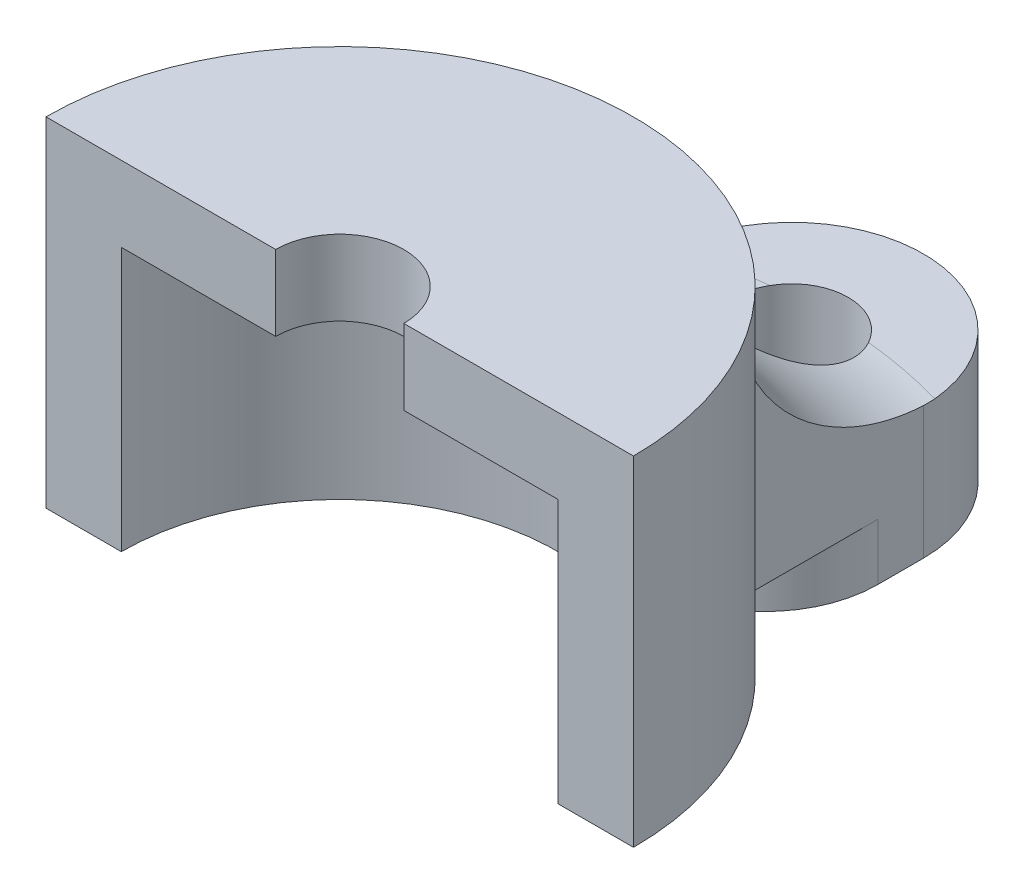
ISO-10303-21;
HEADER;
FILE_DESCRIPTION(('STEP AP214'),'2;1');
FILE_NAME('part.step','',(''),(''),'','','');
FILE_SCHEMA(('AUTOMOTIVE_DESIGN { 1 0 10303 214 1 1 1 1 }'));
ENDSEC;
DATA;
#1=APPLICATION_CONTEXT('core data for automotive mechanical design processes');
#2=APPLICATION_PROTOCOL_DEFINITION('international standard','automotive_design',2000,#1);
#3=PRODUCT_CONTEXT('',#1,'mechanical');
#4=PRODUCT('Part','Part','',(#3));
#5=PRODUCT_RELATED_PRODUCT_CATEGORY('part','',(#4));
#6=PRODUCT_DEFINITION_FORMATION('','',#4);
#7=PRODUCT_DEFINITION_CONTEXT('part definition',#1,'design');
#8=PRODUCT_DEFINITION('design','',#6,#7);
#9=PRODUCT_DEFINITION_SHAPE('','',#8);
#10=(LENGTH_UNIT() NAMED_UNIT(*) SI_UNIT(.MILLI.,.METRE.));
#11=(NAMED_UNIT(*) PLANE_ANGLE_UNIT() SI_UNIT($,.RADIAN.));
#12=(NAMED_UNIT(*) SI_UNIT($,.STERADIAN.) SOLID_ANGLE_UNIT());
#13=UNCERTAINTY_MEASURE_WITH_UNIT(LENGTH_MEASURE(1.E-05),#10,'distance_accuracy_value','');
#14=(GEOMETRIC_REPRESENTATION_CONTEXT(3) GLOBAL_UNCERTAINTY_ASSIGNED_CONTEXT((#13)) GLOBAL_UNIT_ASSIGNED_CONTEXT((#10,
#11,#12)) REPRESENTATION_CONTEXT('',''));
#15=CARTESIAN_POINT('',(0.,0.,0.));
#16=DIRECTION('',(0.,0.,1.));
#17=DIRECTION('',(1.,0.,0.));
#18=AXIS2_PLACEMENT_3D('',#15,#16,#17);
#19=CARTESIAN_POINT('',(0.,7.,0.));
#20=DIRECTION('',(0.,-1.,0.));
#21=DIRECTION('',(0.,0.,-1.));
#22=AXIS2_PLACEMENT_3D('',#19,#20,#21);
#23=CYLINDRICAL_SURFACE('',#22,7.8);
#24=DIRECTION('',(0.,-1.,0.));
#25=VECTOR('',#24,1.);
#26=CARTESIAN_POINT('',(3.5,2.,-6.97065276713738));
#27=LINE('',#26,#25);
#28=CARTESIAN_POINT('',(3.5,7.,-6.97065276713738));
#29=VERTEX_POINT('',#28);
#30=CARTESIAN_POINT('',(3.5,0.,-6.97065276713738));
#31=VERTEX_POINT('',#30);
#32=EDGE_CURVE('E207',#29,#31,#27,.T.);
#33=ORIENTED_EDGE('',*,*,#32,.F.);
#34=CARTESIAN_POINT('',(0.,7.,0.));
#35=DIRECTION('',(0.,-1.,0.));
#36=DIRECTION('',(0.,0.,-1.));
#37=AXIS2_PLACEMENT_3D('',#34,#35,#36);
#38=CIRCLE('',#37,7.8);
#39=CARTESIAN_POINT('',(-3.5,7.,-6.97065276713738));
#40=VERTEX_POINT('',#39);
#41=EDGE_CURVE('E285',#29,#40,#38,.F.);
#42=ORIENTED_EDGE('',*,*,#41,.T.);
#43=DIRECTION('',(0.,-1.,0.));
#44=VECTOR('',#43,1.);
#45=CARTESIAN_POINT('',(-3.5,2.,-6.97065276713738));
#46=LINE('',#45,#44);
#47=CARTESIAN_POINT('',(-3.5,0.,-6.97065276713738));
#48=VERTEX_POINT('',#47);
#49=EDGE_CURVE('E202',#40,#48,#46,.T.);
#50=ORIENTED_EDGE('',*,*,#49,.T.);
#51=CARTESIAN_POINT('',(0.,0.,0.));
#52=DIRECTION('',(0.,1.,0.));
#53=DIRECTION('',(0.,0.,1.));
#54=AXIS2_PLACEMENT_3D('',#51,#52,#53);
#55=CIRCLE('',#54,7.8);
#56=CARTESIAN_POINT('',(-7.8,0.,0.));
#57=VERTEX_POINT('',#56);
#58=EDGE_CURVE('E243',#48,#57,#55,.T.);
#59=ORIENTED_EDGE('',*,*,#58,.T.);
#60=DIRECTION('',(0.,-1.,0.));
#61=VECTOR('',#60,1.);
#62=CARTESIAN_POINT('',(-7.8,7.,0.));
#63=LINE('',#62,#61);
#64=CARTESIAN_POINT('',(-7.8,9.,0.));
#65=VERTEX_POINT('',#64);
#66=EDGE_CURVE('E274',#65,#57,#63,.T.);
#67=ORIENTED_EDGE('',*,*,#66,.F.);
#68=CARTESIAN_POINT('',(0.,9.,0.));
#69=DIRECTION('',(0.,1.,0.));
#70=DIRECTION('',(0.,0.,1.));
#71=AXIS2_PLACEMENT_3D('',#68,#69,#70);
#72=CIRCLE('',#71,7.8);
#73=CARTESIAN_POINT('',(7.8,9.,0.));
#74=VERTEX_POINT('',#73);
#75=EDGE_CURVE('E212',#74,#65,#72,.T.);
#76=ORIENTED_EDGE('',*,*,#75,.F.);
#77=DIRECTION('',(0.,-1.,0.));
#78=VECTOR('',#77,1.);
#79=CARTESIAN_POINT('',(7.8,7.,0.));
#80=LINE('',#79,#78);
#81=CARTESIAN_POINT('',(7.8,0.,0.));
#82=VERTEX_POINT('',#81);
#83=EDGE_CURVE('E248',#74,#82,#80,.T.);
#84=ORIENTED_EDGE('',*,*,#83,.T.);
#85=EDGE_CURVE('E250',#82,#31,#55,.T.);
#86=ORIENTED_EDGE('',*,*,#85,.T.);
#87=EDGE_LOOP('',(#33,#42,#50,#59,#67,#76,#84,#86));
#88=FACE_BOUND('',#87,.T.);
#89=ADVANCED_FACE('F42',(#88),#23,.T.);
#90=CARTESIAN_POINT('',(-7.8,7.,0.));
#91=DIRECTION('',(0.,0.,-1.));
#92=DIRECTION('',(-1.,0.,0.));
#93=AXIS2_PLACEMENT_3D('',#90,#91,#92);
#94=PLANE('',#93);
#95=DIRECTION('',(1.,0.,0.));
#96=VECTOR('',#95,1.);
#97=CARTESIAN_POINT('',(-7.8,0.,0.));
#98=LINE('',#97,#96);
#99=CARTESIAN_POINT('',(-5.8,0.,0.));
#100=VERTEX_POINT('',#99);
#101=EDGE_CURVE('E254',#57,#100,#98,.T.);
#102=ORIENTED_EDGE('',*,*,#101,.T.);
#103=DIRECTION('',(0.,-1.,0.));
#104=VECTOR('',#103,1.);
#105=CARTESIAN_POINT('',(-5.8,7.,0.));
#106=LINE('',#105,#104);
#107=CARTESIAN_POINT('',(-5.8,7.,0.));
#108=VERTEX_POINT('',#107);
#109=EDGE_CURVE('E270',#108,#100,#106,.T.);
#110=ORIENTED_EDGE('',*,*,#109,.F.);
#111=DIRECTION('',(1.,0.,0.));
#112=VECTOR('',#111,1.);
#113=CARTESIAN_POINT('',(-7.8,7.,0.));
#114=LINE('',#113,#112);
#115=CARTESIAN_POINT('',(-1.7,7.,0.));
#116=VERTEX_POINT('',#115);
#117=EDGE_CURVE('E206',#108,#116,#114,.T.);
#118=ORIENTED_EDGE('',*,*,#117,.T.);
#119=DIRECTION('',(0.,-1.,0.));
#120=VECTOR('',#119,1.);
#121=CARTESIAN_POINT('',(-1.7,9.,0.));
#122=LINE('',#121,#120);
#123=CARTESIAN_POINT('',(-1.7,9.,0.));
#124=VERTEX_POINT('',#123);
#125=EDGE_CURVE('E239',#124,#116,#122,.T.);
#126=ORIENTED_EDGE('',*,*,#125,.F.);
#127=DIRECTION('',(1.,0.,0.));
#128=VECTOR('',#127,1.);
#129=CARTESIAN_POINT('',(-7.8,9.,0.));
#130=LINE('',#129,#128);
#131=EDGE_CURVE('E216',#65,#124,#130,.T.);
#132=ORIENTED_EDGE('',*,*,#131,.F.);
#133=ORIENTED_EDGE('',*,*,#66,.T.);
#134=EDGE_LOOP('',(#102,#110,#118,#126,#132,#133));
#135=FACE_BOUND('',#134,.T.);
#136=ADVANCED_FACE('F364',(#135),#94,.F.);
#137=CARTESIAN_POINT('',(0.,7.,0.));
#138=DIRECTION('',(0.,-1.,0.));
#139=DIRECTION('',(0.,0.,-1.));
#140=AXIS2_PLACEMENT_3D('',#137,#138,#139);
#141=CYLINDRICAL_SURFACE('',#140,5.8);
#142=CARTESIAN_POINT('',(0.,0.,0.));
#143=DIRECTION('',(0.,-1.,0.));
#144=DIRECTION('',(0.,0.,1.));
#145=AXIS2_PLACEMENT_3D('',#142,#143,#144);
#146=CIRCLE('',#145,5.8);
#147=CARTESIAN_POINT('',(5.8,0.,0.));
#148=VERTEX_POINT('',#147);
#149=EDGE_CURVE('E258',#100,#148,#146,.T.);
#150=ORIENTED_EDGE('',*,*,#149,.T.);
#151=DIRECTION('',(0.,-1.,0.));
#152=VECTOR('',#151,1.);
#153=CARTESIAN_POINT('',(5.8,7.,0.));
#154=LINE('',#153,#152);
#155=CARTESIAN_POINT('',(5.8,7.,0.));
#156=VERTEX_POINT('',#155);
#157=EDGE_CURVE('E266',#156,#148,#154,.T.);
#158=ORIENTED_EDGE('',*,*,#157,.F.);
#159=CARTESIAN_POINT('',(0.,7.,0.));
#160=DIRECTION('',(0.,-1.,0.));
#161=DIRECTION('',(0.,0.,1.));
#162=AXIS2_PLACEMENT_3D('',#159,#160,#161);
#163=CIRCLE('',#162,5.8);
#164=EDGE_CURVE('E244',#108,#156,#163,.T.);
#165=ORIENTED_EDGE('',*,*,#164,.F.);
#166=ORIENTED_EDGE('',*,*,#109,.T.);
#167=EDGE_LOOP('',(#150,#158,#165,#166));
#168=FACE_BOUND('',#167,.T.);
#169=ADVANCED_FACE('F369',(#168),#141,.F.);
#170=CARTESIAN_POINT('',(5.8,7.,0.));
#171=DIRECTION('',(0.,0.,-1.));
#172=DIRECTION('',(-1.,0.,0.));
#173=AXIS2_PLACEMENT_3D('',#170,#171,#172);
#174=PLANE('',#173);
#175=DIRECTION('',(1.,0.,0.));
#176=VECTOR('',#175,1.);
#177=CARTESIAN_POINT('',(5.8,0.,0.));
#178=LINE('',#177,#176);
#179=EDGE_CURVE('E249',#148,#82,#178,.T.);
#180=ORIENTED_EDGE('',*,*,#179,.T.);
#181=ORIENTED_EDGE('',*,*,#83,.F.);
#182=DIRECTION('',(1.,0.,0.));
#183=VECTOR('',#182,1.);
#184=CARTESIAN_POINT('',(7.8,9.,0.));
#185=LINE('',#184,#183);
#186=CARTESIAN_POINT('',(1.7,9.,0.));
#187=VERTEX_POINT('',#186);
#188=EDGE_CURVE('E223',#187,#74,#185,.T.);
#189=ORIENTED_EDGE('',*,*,#188,.F.);
#190=DIRECTION('',(0.,-1.,0.));
#191=VECTOR('',#190,1.);
#192=CARTESIAN_POINT('',(1.7,9.,0.));
#193=LINE('',#192,#191);
#194=CARTESIAN_POINT('',(1.7,7.,0.));
#195=VERTEX_POINT('',#194);
#196=EDGE_CURVE('E227',#187,#195,#193,.T.);
#197=ORIENTED_EDGE('',*,*,#196,.T.);
#198=DIRECTION('',(1.,0.,0.));
#199=VECTOR('',#198,1.);
#200=CARTESIAN_POINT('',(7.8,7.,0.));
#201=LINE('',#200,#199);
#202=EDGE_CURVE('E217',#195,#156,#201,.T.);
#203=ORIENTED_EDGE('',*,*,#202,.T.);
#204=ORIENTED_EDGE('',*,*,#157,.T.);
#205=EDGE_LOOP('',(#180,#181,#189,#197,#203,#204));
#206=FACE_BOUND('',#205,.T.);
#207=ADVANCED_FACE('F455',(#206),#174,.F.);
#208=CARTESIAN_POINT('',(0.,0.,0.));
#209=DIRECTION('',(0.,1.,0.));
#210=DIRECTION('',(0.,0.,1.));
#211=AXIS2_PLACEMENT_3D('',#208,#209,#210);
#212=PLANE('',#211);
#213=ORIENTED_EDGE('',*,*,#85,.F.);
#214=ORIENTED_EDGE('',*,*,#179,.F.);
#215=ORIENTED_EDGE('',*,*,#149,.F.);
#216=ORIENTED_EDGE('',*,*,#101,.F.);
#217=ORIENTED_EDGE('',*,*,#58,.F.);
#218=DIRECTION('',(0.,0.,1.));
#219=VECTOR('',#218,1.);
#220=CARTESIAN_POINT('',(-3.5,0.,0.));
#221=LINE('',#220,#219);
#222=CARTESIAN_POINT('',(-3.5,0.,-10.7884197174563));
#223=VERTEX_POINT('',#222);
#224=EDGE_CURVE('E64',#223,#48,#221,.T.);
#225=ORIENTED_EDGE('',*,*,#224,.F.);
#226=CARTESIAN_POINT('',(-0.499999999999999,0.,-10.7884197174563));
#227=DIRECTION('',(0.,1.,0.));
#228=DIRECTION('',(0.,0.,1.));
#229=AXIS2_PLACEMENT_3D('',#226,#227,#228);
#230=CIRCLE('',#229,3.);
#231=CARTESIAN_POINT('',(-0.36111111111111,0.,-7.79163646260733));
#232=VERTEX_POINT('',#231);
#233=EDGE_CURVE('E11',#223,#232,#230,.T.);
#234=ORIENTED_EDGE('',*,*,#233,.T.);
#235=CARTESIAN_POINT('',(0.361111111111112,0.,-7.79163646260733));
#236=VERTEX_POINT('',#235);
#237=EDGE_CURVE('E255',#236,#232,#55,.T.);
#238=ORIENTED_EDGE('',*,*,#237,.F.);
#239=CARTESIAN_POINT('',(0.500000000000001,0.,-10.7884197174563));
#240=DIRECTION('',(0.,1.,0.));
#241=DIRECTION('',(0.,0.,1.));
#242=AXIS2_PLACEMENT_3D('',#239,#240,#241);
#243=CIRCLE('',#242,3.);
#244=CARTESIAN_POINT('',(3.5,0.,-10.7884197174563));
#245=VERTEX_POINT('',#244);
#246=EDGE_CURVE('E51',#236,#245,#243,.T.);
#247=ORIENTED_EDGE('',*,*,#246,.T.);
#248=DIRECTION('',(0.,0.,-1.));
#249=VECTOR('',#248,1.);
#250=CARTESIAN_POINT('',(3.5,0.,0.));
#251=LINE('',#250,#249);
#252=EDGE_CURVE('E58',#31,#245,#251,.T.);
#253=ORIENTED_EDGE('',*,*,#252,.F.);
#254=EDGE_LOOP('',(#213,#214,#215,#216,#217,#225,#234,#238,#247,#253));
#255=FACE_BOUND('',#254,.T.);
#256=ADVANCED_FACE('F405',(#255),#212,.F.);
#257=CARTESIAN_POINT('',(0.,7.,0.));
#258=DIRECTION('',(0.,1.,0.));
#259=DIRECTION('',(0.,0.,1.));
#260=AXIS2_PLACEMENT_3D('',#257,#258,#259);
#261=PLANE('',#260);
#262=ORIENTED_EDGE('',*,*,#117,.F.);
#263=ORIENTED_EDGE('',*,*,#164,.T.);
#264=ORIENTED_EDGE('',*,*,#202,.F.);
#265=CARTESIAN_POINT('',(0.,7.,0.));
#266=DIRECTION('',(0.,-1.,0.));
#267=DIRECTION('',(0.,0.,1.));
#268=AXIS2_PLACEMENT_3D('',#265,#266,#267);
#269=CIRCLE('',#268,1.7);
#270=EDGE_CURVE('E230',#116,#195,#269,.T.);
#271=ORIENTED_EDGE('',*,*,#270,.F.);
#272=EDGE_LOOP('',(#262,#263,#264,#271));
#273=FACE_BOUND('',#272,.T.);
#274=ADVANCED_FACE('F454',(#273),#261,.F.);
#275=CARTESIAN_POINT('',(0.,9.,0.));
#276=DIRECTION('',(0.,-1.,0.));
#277=DIRECTION('',(0.,0.,-1.));
#278=AXIS2_PLACEMENT_3D('',#275,#276,#277);
#279=CYLINDRICAL_SURFACE('',#278,1.7);
#280=ORIENTED_EDGE('',*,*,#270,.T.);
#281=ORIENTED_EDGE('',*,*,#196,.F.);
#282=CARTESIAN_POINT('',(0.,9.,0.));
#283=DIRECTION('',(0.,-1.,0.));
#284=DIRECTION('',(0.,0.,1.));
#285=AXIS2_PLACEMENT_3D('',#282,#283,#284);
#286=CIRCLE('',#285,1.7);
#287=EDGE_CURVE('E220',#124,#187,#286,.T.);
#288=ORIENTED_EDGE('',*,*,#287,.F.);
#289=ORIENTED_EDGE('',*,*,#125,.T.);
#290=EDGE_LOOP('',(#280,#281,#288,#289));
#291=FACE_BOUND('',#290,.T.);
#292=ADVANCED_FACE('F534',(#291),#279,.F.);
#293=CARTESIAN_POINT('',(0.,9.,0.));
#294=DIRECTION('',(0.,1.,0.));
#295=DIRECTION('',(0.,0.,1.));
#296=AXIS2_PLACEMENT_3D('',#293,#294,#295);
#297=PLANE('',#296);
#298=ORIENTED_EDGE('',*,*,#75,.T.);
#299=ORIENTED_EDGE('',*,*,#131,.T.);
#300=ORIENTED_EDGE('',*,*,#287,.T.);
#301=ORIENTED_EDGE('',*,*,#188,.T.);
#302=EDGE_LOOP('',(#298,#299,#300,#301));
#303=FACE_BOUND('',#302,.T.);
#304=ADVANCED_FACE('F353',(#303),#297,.T.);
#305=CARTESIAN_POINT('',(0.,2.,0.));
#306=DIRECTION('',(0.,-1.,0.));
#307=DIRECTION('',(0.,0.,-1.));
#308=AXIS2_PLACEMENT_3D('',#305,#306,#307);
#309=CYLINDRICAL_SURFACE('',#308,7.8);
#310=CARTESIAN_POINT('',(0.,-1.5,0.));
#311=DIRECTION('',(0.,-1.,0.));
#312=DIRECTION('',(0.,0.,-1.));
#313=AXIS2_PLACEMENT_3D('',#310,#311,#312);
#314=CIRCLE('',#313,7.8);
#315=CARTESIAN_POINT('',(-0.36111111111111,-1.5,-7.79163646260733));
#316=VERTEX_POINT('',#315);
#317=CARTESIAN_POINT('',(0.361111111111112,-1.5,-7.79163646260733));
#318=VERTEX_POINT('',#317);
#319=EDGE_CURVE('E191',#316,#318,#314,.T.);
#320=ORIENTED_EDGE('',*,*,#319,.T.);
#321=DIRECTION('',(0.,-1.,0.));
#322=VECTOR('',#321,1.);
#323=CARTESIAN_POINT('',(0.361111111111112,2.,-7.79163646260733));
#324=LINE('',#323,#322);
#325=EDGE_CURVE('E395',#318,#236,#324,.F.);
#326=ORIENTED_EDGE('',*,*,#325,.T.);
#327=ORIENTED_EDGE('',*,*,#237,.T.);
#328=DIRECTION('',(0.,-1.,0.));
#329=VECTOR('',#328,1.);
#330=CARTESIAN_POINT('',(-0.36111111111111,2.,-7.79163646260733));
#331=LINE('',#330,#329);
#332=EDGE_CURVE('E391',#232,#316,#331,.T.);
#333=ORIENTED_EDGE('',*,*,#332,.T.);
#334=EDGE_LOOP('',(#320,#326,#327,#333));
#335=FACE_BOUND('',#334,.T.);
#336=ADVANCED_FACE('F342',(#335),#309,.F.);
#337=CARTESIAN_POINT('',(-3.5,2.,0.));
#338=DIRECTION('',(1.,0.,0.));
#339=DIRECTION('',(0.,0.,-1.));
#340=AXIS2_PLACEMENT_3D('',#337,#338,#339);
#341=PLANE('',#340);
#342=DIRECTION('',(0.,0.,1.));
#343=VECTOR('',#342,1.);
#344=CARTESIAN_POINT('',(-3.5,-1.5,0.));
#345=LINE('',#344,#343);
#346=CARTESIAN_POINT('',(-3.5,-1.5,-12.));
#347=VERTEX_POINT('',#346);
#348=CARTESIAN_POINT('',(-3.5,-1.5,-10.7884197174563));
#349=VERTEX_POINT('',#348);
#350=EDGE_CURVE('E159',#347,#349,#345,.T.);
#351=ORIENTED_EDGE('',*,*,#350,.T.);
#352=DIRECTION('',(0.,-1.,0.));
#353=VECTOR('',#352,1.);
#354=CARTESIAN_POINT('',(-3.5,2.,-10.7884197174563));
#355=LINE('',#354,#353);
#356=EDGE_CURVE('E400',#349,#223,#355,.F.);
#357=ORIENTED_EDGE('',*,*,#356,.T.);
#358=ORIENTED_EDGE('',*,*,#224,.T.);
#359=ORIENTED_EDGE('',*,*,#49,.F.);
#360=CARTESIAN_POINT('',(-3.5,7.,-6.97065276713738));
#361=CARTESIAN_POINT('',(-3.5,6.86823671626228,-6.9706218991886));
#362=CARTESIAN_POINT('',(-3.5,6.73648547428623,-6.97647967766274));
#363=CARTESIAN_POINT('',(-3.5,6.47405745796886,-6.99974126741131));
#364=CARTESIAN_POINT('',(-3.5,6.34338027407757,-7.01714044928466));
#365=CARTESIAN_POINT('',(-3.5,6.0845976502858,-7.06315539428935));
#366=CARTESIAN_POINT('',(-3.5,5.95648360664042,-7.09172290616116));
#367=CARTESIAN_POINT('',(-3.5,5.7031532246982,-7.15966433827299));
#368=CARTESIAN_POINT('',(-3.5,5.57793707402591,-7.1990389561102));
#369=CARTESIAN_POINT('',(-3.5,5.33140655298456,-7.288024226344));
#370=CARTESIAN_POINT('',(-3.5,5.21008667260468,-7.33761961487014));
#371=CARTESIAN_POINT('',(-3.5,4.9718584250637,-7.44650006056829));
#372=CARTESIAN_POINT('',(-3.5,4.85495174101407,-7.50578876954371));
#373=CARTESIAN_POINT('',(-3.5,4.5117259263191,-7.69735525109701));
#374=CARTESIAN_POINT('',(-3.5,4.29289316035297,-7.84333626331792));
#375=CARTESIAN_POINT('',(-3.5,3.86788502205746,-8.17591703058829));
#376=CARTESIAN_POINT('',(-3.5,3.66318277304708,-8.36438335986996));
#377=CARTESIAN_POINT('',(-3.5,3.28511694545256,-8.77055002971868));
#378=CARTESIAN_POINT('',(-3.5,3.11176534881782,-8.98826149235577));
#379=CARTESIAN_POINT('',(-3.5,2.78615399876281,-9.46735093819537));
#380=CARTESIAN_POINT('',(-3.5,2.63705875204207,-9.73088198912312));
#381=CARTESIAN_POINT('',(-3.5,2.38367485518992,-10.2785772557246));
#382=CARTESIAN_POINT('',(-3.5,2.27936173557937,-10.5627301039187));
#383=CARTESIAN_POINT('',(-3.5,2.14709635179676,-11.0405295466162));
#384=CARTESIAN_POINT('',(-3.5,2.1051805605681,-11.2304212997973));
#385=CARTESIAN_POINT('',(-3.5,2.0417315507288,-11.6133114646566));
#386=CARTESIAN_POINT('',(-3.5,2.02017071620863,-11.8063053048567));
#387=CARTESIAN_POINT('',(-3.5,2.00900811461289,-12.));
#388=B_SPLINE_CURVE_WITH_KNOTS('',3,(#360,#361,#362,#363,#364,#365,#366,#367,#368,#369,#370,
#371,#372,#373,#374,#375,#376,#377,#378,#379,#380,#381,#382,#383,#384,#385,#386,#387),
.UNSPECIFIED.,.F.,.F.,(4,2,2,2,2,2,2,2,2,2,2,2,2,4),(0.,0.395140779767936,0.790123159396702,
1.18341760122884,1.57673743613589,1.96947408277316,2.36235902904348,3.14810405618437,
3.9794809509514,4.81117492239391,5.71550858161135,6.61934747143437,7.20172171769979,
7.78330470680458),.UNSPECIFIED.);
#389=CARTESIAN_POINT('',(-3.5,2.00900811461289,-12.));
#390=VERTEX_POINT('',#389);
#391=EDGE_CURVE('E162',#40,#390,#388,.T.);
#392=ORIENTED_EDGE('',*,*,#391,.T.);
#393=DIRECTION('',(0.,-1.,0.));
#394=VECTOR('',#393,1.);
#395=CARTESIAN_POINT('',(-3.5,2.,-12.));
#396=LINE('',#395,#394);
#397=EDGE_CURVE('E155',#390,#347,#396,.T.);
#398=ORIENTED_EDGE('',*,*,#397,.T.);
#399=EDGE_LOOP('',(#351,#357,#358,#359,#392,#398));
#400=FACE_BOUND('',#399,.T.);
#401=ADVANCED_FACE('F157',(#400),#341,.F.);
#402=CARTESIAN_POINT('',(3.5,2.,0.));
#403=DIRECTION('',(1.,0.,0.));
#404=DIRECTION('',(0.,0.,-1.));
#405=AXIS2_PLACEMENT_3D('',#402,#403,#404);
#406=PLANE('',#405);
#407=ORIENTED_EDGE('',*,*,#252,.T.);
#408=DIRECTION('',(0.,1.,0.));
#409=VECTOR('',#408,1.);
#410=CARTESIAN_POINT('',(3.5,-1.5,-10.7884197174563));
#411=LINE('',#410,#409);
#412=CARTESIAN_POINT('',(3.5,-1.5,-10.7884197174563));
#413=VERTEX_POINT('',#412);
#414=EDGE_CURVE('E380',#245,#413,#411,.F.);
#415=ORIENTED_EDGE('',*,*,#414,.T.);
#416=DIRECTION('',(0.,0.,1.));
#417=VECTOR('',#416,1.);
#418=CARTESIAN_POINT('',(3.5,-1.5,0.));
#419=LINE('',#418,#417);
#420=CARTESIAN_POINT('',(3.5,-1.5,-12.));
#421=VERTEX_POINT('',#420);
#422=EDGE_CURVE('E177',#421,#413,#419,.T.);
#423=ORIENTED_EDGE('',*,*,#422,.F.);
#424=DIRECTION('',(0.,-1.,0.));
#425=VECTOR('',#424,1.);
#426=CARTESIAN_POINT('',(3.5,2.,-12.));
#427=LINE('',#426,#425);
#428=CARTESIAN_POINT('',(3.5,2.00900811461289,-12.));
#429=VERTEX_POINT('',#428);
#430=EDGE_CURVE('E166',#429,#421,#427,.T.);
#431=ORIENTED_EDGE('',*,*,#430,.F.);
#432=CARTESIAN_POINT('',(3.5,2.00900811461289,-12.));
#433=CARTESIAN_POINT('',(3.5,2.01793094000883,-11.8451307273015));
#434=CARTESIAN_POINT('',(3.5,2.03351137485017,-11.6906565412159));
#435=CARTESIAN_POINT('',(3.5,2.07771238803744,-11.3836061783583));
#436=CARTESIAN_POINT('',(3.5,2.10633109733114,-11.2310297327623));
#437=CARTESIAN_POINT('',(3.5,2.17631450990522,-10.9289317281104));
#438=CARTESIAN_POINT('',(3.5,2.21767126825504,-10.7794083266331));
#439=CARTESIAN_POINT('',(3.5,2.31278234073056,-10.4843556267896));
#440=CARTESIAN_POINT('',(3.5,2.36653691907595,-10.3388264136207));
#441=CARTESIAN_POINT('',(3.5,2.486028369042,-10.0528006521842));
#442=CARTESIAN_POINT('',(3.5,2.55176335440607,-9.91230331583284));
#443=CARTESIAN_POINT('',(3.5,2.69479148252029,-9.63725785324691));
#444=CARTESIAN_POINT('',(3.5,2.77208860264163,-9.5027117949684));
#445=CARTESIAN_POINT('',(3.5,2.93772315645795,-9.24060118500103));
#446=CARTESIAN_POINT('',(3.5,3.02606013838755,-9.11303634793856));
#447=CARTESIAN_POINT('',(3.5,3.21323386715555,-8.86585881396364));
#448=CARTESIAN_POINT('',(3.5,3.31207027930276,-8.74624586376573));
#449=CARTESIAN_POINT('',(3.5,3.51974488357441,-8.51585413860501));
#450=CARTESIAN_POINT('',(3.5,3.628591309825,-8.40508277908586));
#451=CARTESIAN_POINT('',(3.5,3.85552201256424,-8.1935349591479));
#452=CARTESIAN_POINT('',(3.5,3.97360231487143,-8.09275424073421));
#453=CARTESIAN_POINT('',(3.5,4.21839874176892,-7.90210149306975));
#454=CARTESIAN_POINT('',(3.5,4.34512042100704,-7.81223658566191));
#455=CARTESIAN_POINT('',(3.5,4.60623899141991,-7.64458743580362));
#456=CARTESIAN_POINT('',(3.5,4.74063169205117,-7.56679668222845));
#457=CARTESIAN_POINT('',(3.5,5.00838216858371,-7.4283258090906));
#458=CARTESIAN_POINT('',(3.5,5.1413678441795,-7.36692635185127));
#459=CARTESIAN_POINT('',(3.5,5.41235971797762,-7.25663422379488));
#460=CARTESIAN_POINT('',(3.5,5.55036312917021,-7.20773472774493));
#461=CARTESIAN_POINT('',(3.5,5.8300735838419,-7.12324804357175));
#462=CARTESIAN_POINT('',(3.5,5.97177225104917,-7.08763314570175));
#463=CARTESIAN_POINT('',(3.5,6.25786721606293,-7.03019911293064));
#464=CARTESIAN_POINT('',(3.5,6.40226153651191,-7.00837024552492));
#465=CARTESIAN_POINT('',(3.5,6.62257307414056,-6.98597144819146));
#466=CARTESIAN_POINT('',(3.5,6.69799630393872,-6.98022623117015));
#467=CARTESIAN_POINT('',(3.5,6.84894238794852,-6.97256856610466));
#468=CARTESIAN_POINT('',(3.5,6.92446499949557,-6.97065133229729));
#469=CARTESIAN_POINT('',(3.5,7.,-6.97065276713738));
#470=B_SPLINE_CURVE_WITH_KNOTS('',3,(#432,#433,#434,#435,#436,#437,#438,#439,#440,#441,#442,
#443,#444,#445,#446,#447,#448,#449,#450,#451,#452,#453,#454,#455,#456,#457,#458,#459,#460,#461,
#462,#463,#464,#465,#466,#467,#468,#469),.UNSPECIFIED.,.F.,.F.,(4,2,2,2,2,2,2,2,2,2,2,2,2,2,2,2,
2,2,4),(0.,0.465219970828406,0.930373272791159,1.39523703649794,1.86011070819743,
2.32491125093734,2.78987205422154,3.25481383693627,3.71974080310915,4.18505369350236,
4.65016740790594,5.11558296656314,5.58074666600968,6.01957744290483,6.45816809498287,
6.89583872571925,7.33320002832309,7.56004000159088,7.78659620040014),.UNSPECIFIED.);
#471=EDGE_CURVE('E321',#429,#29,#470,.T.);
#472=ORIENTED_EDGE('',*,*,#471,.T.);
#473=ORIENTED_EDGE('',*,*,#32,.T.);
#474=EDGE_LOOP('',(#407,#415,#423,#431,#472,#473));
#475=FACE_BOUND('',#474,.T.);
#476=ADVANCED_FACE('F341',(#475),#406,.T.);
#477=CARTESIAN_POINT('',(0.,2.,-12.));
#478=DIRECTION('',(0.,-1.,0.));
#479=DIRECTION('',(0.,0.,-1.));
#480=AXIS2_PLACEMENT_3D('',#477,#478,#479);
#481=CYLINDRICAL_SURFACE('',#480,1.5);
#482=CARTESIAN_POINT('',(0.,2.,-12.));
#483=DIRECTION('',(0.,-1.,0.));
#484=DIRECTION('',(0.,0.,-1.));
#485=AXIS2_PLACEMENT_3D('',#482,#483,#484);
#486=CIRCLE('',#485,1.5);
#487=CARTESIAN_POINT('',(-1.30875252042631,2.,-12.7329166666667));
#488=VERTEX_POINT('',#487);
#489=CARTESIAN_POINT('',(1.30875252042631,2.,-12.7329166666667));
#490=VERTEX_POINT('',#489);
#491=EDGE_CURVE('E195',#488,#490,#486,.T.);
#492=ORIENTED_EDGE('',*,*,#491,.F.);
#493=CARTESIAN_POINT('',(-1.30875252042631,2.,-12.7329166666667));
#494=CARTESIAN_POINT('',(-1.32875174538573,1.99999952994558,-12.6972047949433));
#495=CARTESIAN_POINT('',(-1.34727914114004,2.00033674474429,-12.6606893996074));
#496=CARTESIAN_POINT('',(-1.38128595752744,2.00178556769655,-12.5862799273691));
#497=CARTESIAN_POINT('',(-1.39676530197976,2.00289719520207,-12.5483858160361));
#498=CARTESIAN_POINT('',(-1.43841618747054,2.00753584829923,-12.4331389770261));
#499=CARTESIAN_POINT('',(-1.45988369410719,2.01236583518955,-12.3540729273001));
#500=CARTESIAN_POINT('',(-1.4896633170332,2.02603763171077,-12.1938070322853));
#501=CARTESIAN_POINT('',(-1.49796394158143,2.03488293716713,-12.1126053858547));
#502=CARTESIAN_POINT('',(-1.50137202279643,2.05675345860904,-11.9505117862413));
#503=CARTESIAN_POINT('',(-1.49648317962454,2.0697775013922,-11.8696197525758));
#504=CARTESIAN_POINT('',(-1.47396288837896,2.09978235603457,-11.7103205249644));
#505=CARTESIAN_POINT('',(-1.4563188009529,2.1167670812725,-11.6319158763093));
#506=CARTESIAN_POINT('',(-1.40909832876559,2.15405650233442,-11.4796108956089));
#507=CARTESIAN_POINT('',(-1.37951687163571,2.17436260727886,-11.4057124937204));
#508=CARTESIAN_POINT('',(-1.30776078232382,2.21834593915317,-11.2606634478528));
#509=CARTESIAN_POINT('',(-1.26505301738167,2.24213772884833,-11.1898117563012));
#510=CARTESIAN_POINT('',(-1.16883778875848,2.2908588384061,-11.0562852960651));
#511=CARTESIAN_POINT('',(-1.11532547347188,2.31578866537984,-10.9936142216415));
#512=CARTESIAN_POINT('',(-0.995028220471856,2.36656942558473,-10.8741491834907));
#513=CARTESIAN_POINT('',(-0.927628534705959,2.39238243353168,-10.8179554870098));
#514=CARTESIAN_POINT('',(-0.783275829991527,2.44091847386286,-10.7177380676374));
#515=CARTESIAN_POINT('',(-0.706322342379554,2.46364135454568,-10.6737149421176));
#516=CARTESIAN_POINT('',(-0.546513041479579,2.50284825292664,-10.6004075187056));
#517=CARTESIAN_POINT('',(-0.463843504709733,2.51946907342423,-10.5707944576239));
#518=CARTESIAN_POINT('',(-0.293506450554873,2.54483175058378,-10.5263756942753));
#519=CARTESIAN_POINT('',(-0.205846894507631,2.55358580332551,-10.5115470673472));
#520=CARTESIAN_POINT('',(-0.040319044225079,2.5612587945388,-10.4985481257678));
#521=CARTESIAN_POINT('',(0.0373521278317354,2.56130164374795,-10.4984742001832));
#522=CARTESIAN_POINT('',(0.191458197041567,2.554343752325,-10.5102642206049));
#523=CARTESIAN_POINT('',(0.267893102111498,2.54734305681713,-10.5221280901322));
#524=CARTESIAN_POINT('',(0.413275893041063,2.52774291759005,-10.5562243877754));
#525=CARTESIAN_POINT('',(0.482405964111141,2.51545904646043,-10.5778754712296));
#526=CARTESIAN_POINT('',(0.616074998501904,2.48663823085765,-10.6304691816413));
#527=CARTESIAN_POINT('',(0.680612556703593,2.47009999180567,-10.661414637302));
#528=CARTESIAN_POINT('',(0.810196105051083,2.43236864968078,-10.7352145368303));
#529=CARTESIAN_POINT('',(0.87465327604891,2.41087606839001,-10.778947776398));
#530=CARTESIAN_POINT('',(0.995725370750387,2.36620511197639,-10.8754853999187));
#531=CARTESIAN_POINT('',(1.05233586183624,2.34302579519355,-10.9282948736462));
#532=CARTESIAN_POINT('',(1.16280914400061,2.29389686049915,-11.0485365910331));
#533=CARTESIAN_POINT('',(1.21560179480489,2.26793609629646,-11.1169529013762));
#534=CARTESIAN_POINT('',(1.30892048542912,2.21781055501689,-11.2623104582947));
#535=CARTESIAN_POINT('',(1.34944482303681,2.19364602751609,-11.3392528858363));
#536=CARTESIAN_POINT('',(1.41713906284265,2.14844762902451,-11.5005686262464));
#537=CARTESIAN_POINT('',(1.44418561611176,2.12744386001347,-11.5850025317398));
#538=CARTESIAN_POINT('',(1.48304900939894,2.08997511700109,-11.7582650579149));
#539=CARTESIAN_POINT('',(1.49487350474603,2.07350786481673,-11.8470914462132));
#540=CARTESIAN_POINT('',(1.50220724395192,2.04656224285115,-12.0204736453106));
#541=CARTESIAN_POINT('',(1.49871118650103,2.03576830834025,-12.1049394405668));
#542=CARTESIAN_POINT('',(1.47744914655586,2.01862047520958,-12.2725121273169));
#543=CARTESIAN_POINT('',(1.45969085058539,2.01226418840208,-12.3556197261897));
#544=CARTESIAN_POINT('',(1.41937864763419,2.00511587408926,-12.4881250578592));
#545=CARTESIAN_POINT('',(1.40094132897762,2.00313969048905,-12.5387543637571));
#546=CARTESIAN_POINT('',(1.35876374737589,2.0005807004931,-12.6376927820155));
#547=CARTESIAN_POINT('',(1.33503224803579,1.99999560982957,-12.6860055702234));
#548=CARTESIAN_POINT('',(1.30875252042631,2.,-12.7329166666667));
#549=B_SPLINE_CURVE_WITH_KNOTS('',3,(#493,#494,#495,#496,#497,#498,#499,#500,#501,#502,#503,
#504,#505,#506,#507,#508,#509,#510,#511,#512,#513,#514,#515,#516,#517,#518,#519,#520,#521,#522,
#523,#524,#525,#526,#527,#528,#529,#530,#531,#532,#533,#534,#535,#536,#537,#538,#539,#540,#541,
#542,#543,#544,#545,#546,#547,#548),.UNSPECIFIED.,.F.,.F.,(4,2,2,2,2,2,2,2,2,2,2,2,2,2,2,2,2,2,
2,2,2,2,2,2,2,2,2,4),(0.,0.122718980297179,0.245441027354014,0.490380248433288,
0.735533129240645,0.980617242232678,1.22594454601814,1.47137620302851,1.72850853802644,
1.98575659188071,2.25885922293008,2.53197525637475,2.79852809701416,3.06466697648896,
3.29644382648485,3.52821919162012,3.74774066013927,3.96732900691355,4.20877476275166,
4.45035636108353,4.71980371295267,4.98928843317012,5.26119615347351,5.53296707510656,
5.78736383031395,6.04162357227662,6.20307362173688,6.36425837574519),.UNSPECIFIED.);
#550=EDGE_CURVE('E289',#488,#490,#549,.T.);
#551=ORIENTED_EDGE('',*,*,#550,.T.);
#552=EDGE_LOOP('',(#492,#551));
#553=FACE_BOUND('',#552,.T.);
#554=CARTESIAN_POINT('',(0.,-1.5,-12.));
#555=DIRECTION('',(0.,-1.,0.));
#556=DIRECTION('',(0.,0.,-1.));
#557=AXIS2_PLACEMENT_3D('',#554,#555,#556);
#558=CIRCLE('',#557,1.5);
#559=CARTESIAN_POINT('',(0.,-1.5,-13.5));
#560=VERTEX_POINT('',#559);
#561=EDGE_CURVE('E183',#560,#560,#558,.T.);
#562=ORIENTED_EDGE('',*,*,#561,.T.);
#563=EDGE_LOOP('',(#562));
#564=FACE_BOUND('',#563,.T.);
#565=ADVANCED_FACE('F305',(#553,#564),#481,.F.);
#566=CARTESIAN_POINT('',(0.,2.,-12.));
#567=DIRECTION('',(0.,-1.,0.));
#568=DIRECTION('',(0.,0.,-1.));
#569=AXIS2_PLACEMENT_3D('',#566,#567,#568);
#570=CYLINDRICAL_SURFACE('',#569,3.5);
#571=ORIENTED_EDGE('',*,*,#430,.T.);
#572=CARTESIAN_POINT('',(0.,-1.5,-12.));
#573=DIRECTION('',(0.,-1.,0.));
#574=DIRECTION('',(0.,0.,-1.));
#575=AXIS2_PLACEMENT_3D('',#572,#573,#574);
#576=CIRCLE('',#575,3.5);
#577=EDGE_CURVE('E170',#347,#421,#576,.T.);
#578=ORIENTED_EDGE('',*,*,#577,.F.);
#579=ORIENTED_EDGE('',*,*,#397,.F.);
#580=CARTESIAN_POINT('',(-3.5,2.00900811461289,-12.));
#581=CARTESIAN_POINT('',(-3.50000073679333,2.0059848239925,-12.052773025363));
#582=CARTESIAN_POINT('',(-3.49880802205714,2.00372250246168,-12.1055136973597));
#583=CARTESIAN_POINT('',(-3.49403568819285,2.00071979674059,-12.2109303640625));
#584=CARTESIAN_POINT('',(-3.49045606773146,1.99997941340044,-12.2636063587325));
#585=CARTESIAN_POINT('',(-3.48568299440727,2.,-12.31625));
#586=B_SPLINE_CURVE_WITH_KNOTS('',3,(#580,#581,#582,#583,#584,#585),.UNSPECIFIED.,.F.,.F.,(4,2,
4),(0.,0.158407930193981,0.316815948871889),.UNSPECIFIED.);
#587=CARTESIAN_POINT('',(-3.48568299440726,2.,-12.31625));
#588=VERTEX_POINT('',#587);
#589=EDGE_CURVE('E333',#390,#588,#586,.T.);
#590=ORIENTED_EDGE('',*,*,#589,.T.);
#591=CARTESIAN_POINT('',(0.,2.,-12.));
#592=DIRECTION('',(0.,-1.,0.));
#593=DIRECTION('',(0.,0.,-1.));
#594=AXIS2_PLACEMENT_3D('',#591,#592,#593);
#595=CIRCLE('',#594,3.5);
#596=CARTESIAN_POINT('',(3.48568299440727,2.,-12.31625));
#597=VERTEX_POINT('',#596);
#598=EDGE_CURVE('E167',#588,#597,#595,.T.);
#599=ORIENTED_EDGE('',*,*,#598,.T.);
#600=CARTESIAN_POINT('',(3.48568299440727,2.,-12.31625));
#601=CARTESIAN_POINT('',(3.49045606773146,1.99997941340044,-12.2636063587325));
#602=CARTESIAN_POINT('',(3.49403568819285,2.00071979674059,-12.2109303640625));
#603=CARTESIAN_POINT('',(3.49880802205715,2.00372250246168,-12.1055136973597));
#604=CARTESIAN_POINT('',(3.50000073679334,2.00598482399249,-12.052773025363));
#605=CARTESIAN_POINT('',(3.5,2.00900811461288,-12.));
#606=B_SPLINE_CURVE_WITH_KNOTS('',3,(#600,#601,#602,#603,#604,#605),.UNSPECIFIED.,.F.,.F.,(4,2,
4),(0.,0.15840801867791,0.316815948871891),.UNSPECIFIED.);
#607=EDGE_CURVE('E298',#597,#429,#606,.T.);
#608=ORIENTED_EDGE('',*,*,#607,.T.);
#609=EDGE_LOOP('',(#571,#578,#579,#590,#599,#608));
#610=FACE_BOUND('',#609,.T.);
#611=ADVANCED_FACE('F171',(#610),#570,.T.);
#612=CARTESIAN_POINT('',(0.,2.,0.));
#613=DIRECTION('',(0.,-1.,0.));
#614=DIRECTION('',(0.,0.,-1.));
#615=AXIS2_PLACEMENT_3D('',#612,#613,#614);
#616=PLANE('',#615);
#617=ORIENTED_EDGE('',*,*,#598,.F.);
#618=CARTESIAN_POINT('',(0.,2.,0.));
#619=DIRECTION('',(0.,-1.,0.));
#620=DIRECTION('',(0.,0.,-1.));
#621=AXIS2_PLACEMENT_3D('',#618,#619,#620);
#622=CIRCLE('',#621,12.8);
#623=EDGE_CURVE('E281',#588,#488,#622,.T.);
#624=ORIENTED_EDGE('',*,*,#623,.T.);
#625=ORIENTED_EDGE('',*,*,#491,.T.);
#626=CARTESIAN_POINT('',(0.,2.,0.));
#627=DIRECTION('',(0.,-1.,0.));
#628=DIRECTION('',(0.,0.,-1.));
#629=AXIS2_PLACEMENT_3D('',#626,#627,#628);
#630=CIRCLE('',#629,12.8);
#631=EDGE_CURVE('E278',#490,#597,#630,.T.);
#632=ORIENTED_EDGE('',*,*,#631,.T.);
#633=EDGE_LOOP('',(#617,#624,#625,#632));
#634=FACE_BOUND('',#633,.T.);
#635=ADVANCED_FACE('F345',(#634),#616,.F.);
#636=CARTESIAN_POINT('',(0.,-1.5,0.));
#637=DIRECTION('',(0.,-1.,0.));
#638=DIRECTION('',(0.,0.,-1.));
#639=AXIS2_PLACEMENT_3D('',#636,#637,#638);
#640=PLANE('',#639);
#641=ORIENTED_EDGE('',*,*,#561,.F.);
#642=EDGE_LOOP('',(#641));
#643=FACE_BOUND('',#642,.T.);
#644=ORIENTED_EDGE('',*,*,#422,.T.);
#645=CARTESIAN_POINT('',(0.500000000000001,-1.5,-10.7884197174563));
#646=DIRECTION('',(0.,-1.,0.));
#647=DIRECTION('',(0.,0.,-1.));
#648=AXIS2_PLACEMENT_3D('',#645,#646,#647);
#649=CIRCLE('',#648,3.);
#650=EDGE_CURVE('E388',#413,#318,#649,.T.);
#651=ORIENTED_EDGE('',*,*,#650,.T.);
#652=ORIENTED_EDGE('',*,*,#319,.F.);
#653=CARTESIAN_POINT('',(-0.499999999999999,-1.5,-10.7884197174563));
#654=DIRECTION('',(0.,-1.,0.));
#655=DIRECTION('',(0.,0.,-1.));
#656=AXIS2_PLACEMENT_3D('',#653,#654,#655);
#657=CIRCLE('',#656,3.);
#658=EDGE_CURVE('E181',#316,#349,#657,.T.);
#659=ORIENTED_EDGE('',*,*,#658,.T.);
#660=ORIENTED_EDGE('',*,*,#350,.F.);
#661=ORIENTED_EDGE('',*,*,#577,.T.);
#662=EDGE_LOOP('',(#644,#651,#652,#659,#660,#661));
#663=FACE_BOUND('',#662,.T.);
#664=ADVANCED_FACE('F179',(#643,#663),#640,.T.);
#665=CARTESIAN_POINT('',(0.,7.,0.));
#666=DIRECTION('',(0.,-1.,0.));
#667=DIRECTION('',(0.,0.,-1.));
#668=AXIS2_PLACEMENT_3D('',#665,#666,#667);
#669=TOROIDAL_SURFACE('',#668,12.8,5.);
#670=ORIENTED_EDGE('',*,*,#391,.F.);
#671=ORIENTED_EDGE('',*,*,#41,.F.);
#672=ORIENTED_EDGE('',*,*,#471,.F.);
#673=ORIENTED_EDGE('',*,*,#607,.F.);
#674=ORIENTED_EDGE('',*,*,#631,.F.);
#675=ORIENTED_EDGE('',*,*,#550,.F.);
#676=ORIENTED_EDGE('',*,*,#623,.F.);
#677=ORIENTED_EDGE('',*,*,#589,.F.);
#678=EDGE_LOOP('',(#670,#671,#672,#673,#674,#675,#676,#677));
#679=FACE_BOUND('',#678,.T.);
#680=ADVANCED_FACE('F309',(#679),#669,.F.);
#681=CARTESIAN_POINT('',(0.500000000000001,2.,-10.7884197174563));
#682=DIRECTION('',(0.,-1.,0.));
#683=DIRECTION('',(0.,0.,-1.));
#684=AXIS2_PLACEMENT_3D('',#681,#682,#683);
#685=CYLINDRICAL_SURFACE('',#684,3.);
#686=ORIENTED_EDGE('',*,*,#246,.F.);
#687=ORIENTED_EDGE('',*,*,#325,.F.);
#688=ORIENTED_EDGE('',*,*,#650,.F.);
#689=ORIENTED_EDGE('',*,*,#414,.F.);
#690=EDGE_LOOP('',(#686,#687,#688,#689));
#691=FACE_BOUND('',#690,.T.);
#692=ADVANCED_FACE('F313',(#691),#685,.T.);
#693=CARTESIAN_POINT('',(-0.499999999999999,2.,-10.7884197174563));
#694=DIRECTION('',(0.,-1.,0.));
#695=DIRECTION('',(0.,0.,-1.));
#696=AXIS2_PLACEMENT_3D('',#693,#694,#695);
#697=CYLINDRICAL_SURFACE('',#696,3.);
#698=ORIENTED_EDGE('',*,*,#233,.F.);
#699=ORIENTED_EDGE('',*,*,#356,.F.);
#700=ORIENTED_EDGE('',*,*,#658,.F.);
#701=ORIENTED_EDGE('',*,*,#332,.F.);
#702=EDGE_LOOP('',(#698,#699,#700,#701));
#703=FACE_BOUND('',#702,.T.);
#704=ADVANCED_FACE('F44',(#703),#697,.T.);
#705=CLOSED_SHELL('',(#89,#136,#169,#207,#256,#274,#292,#304,#336,#401,#476,#565,#611,#635,#664,
#680,#692,#704));
#706=MANIFOLD_SOLID_BREP('B2',#705);
#707=ADVANCED_BREP_SHAPE_REPRESENTATION('',(#18,#706),#14);
#708=SHAPE_DEFINITION_REPRESENTATION(#9,#707);
ENDSEC;
END-ISO-10303-21;
